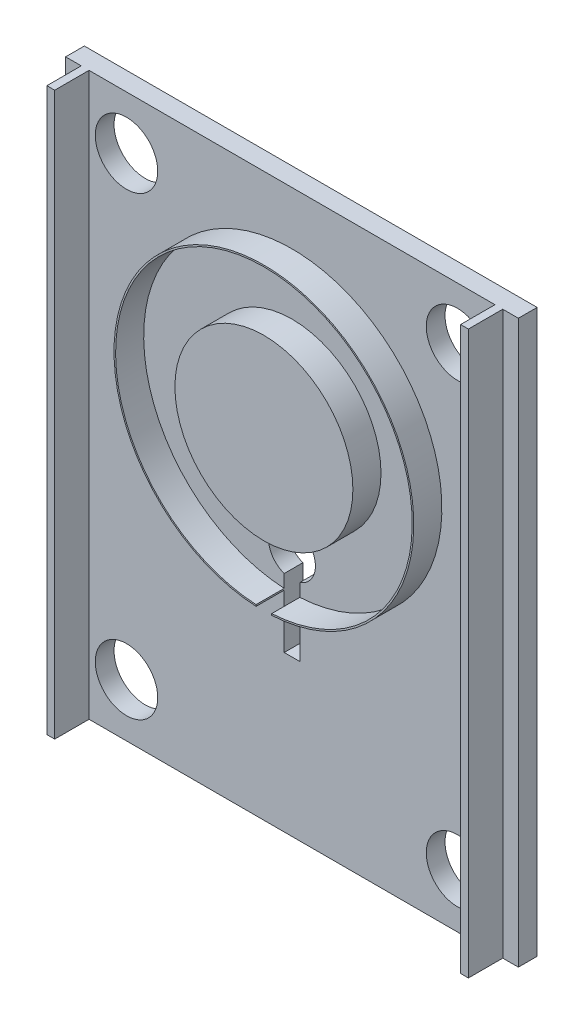
ISO-10303-21;
HEADER;
FILE_DESCRIPTION(('STEP AP214'),'2;1');
FILE_NAME('part.step','',(''),(''),'','','');
FILE_SCHEMA(('AUTOMOTIVE_DESIGN { 1 0 10303 214 1 1 1 1 }'));
ENDSEC;
DATA;
#1=APPLICATION_CONTEXT('core data for automotive mechanical design processes');
#2=APPLICATION_PROTOCOL_DEFINITION('international standard','automotive_design',2000,#1);
#3=PRODUCT_CONTEXT('',#1,'mechanical');
#4=PRODUCT('Part','Part','',(#3));
#5=PRODUCT_RELATED_PRODUCT_CATEGORY('part','',(#4));
#6=PRODUCT_DEFINITION_FORMATION('','',#4);
#7=PRODUCT_DEFINITION_CONTEXT('part definition',#1,'design');
#8=PRODUCT_DEFINITION('design','',#6,#7);
#9=PRODUCT_DEFINITION_SHAPE('','',#8);
#10=(LENGTH_UNIT() NAMED_UNIT(*) SI_UNIT(.MILLI.,.METRE.));
#11=(NAMED_UNIT(*) PLANE_ANGLE_UNIT() SI_UNIT($,.RADIAN.));
#12=(NAMED_UNIT(*) SI_UNIT($,.STERADIAN.) SOLID_ANGLE_UNIT());
#13=UNCERTAINTY_MEASURE_WITH_UNIT(LENGTH_MEASURE(1.E-05),#10,'distance_accuracy_value','');
#14=(GEOMETRIC_REPRESENTATION_CONTEXT(3) GLOBAL_UNCERTAINTY_ASSIGNED_CONTEXT((#13)) GLOBAL_UNIT_ASSIGNED_CONTEXT((#10,
#11,#12)) REPRESENTATION_CONTEXT('',''));
#15=CARTESIAN_POINT('',(0.,0.,0.));
#16=DIRECTION('',(0.,0.,1.));
#17=DIRECTION('',(1.,0.,0.));
#18=AXIS2_PLACEMENT_3D('',#15,#16,#17);
#19=CARTESIAN_POINT('',(0.,25.0080977488986,15.));
#20=DIRECTION('',(0.,0.,-1.));
#21=DIRECTION('',(-1.,0.,0.));
#22=AXIS2_PLACEMENT_3D('',#19,#20,#21);
#23=CYLINDRICAL_SURFACE('',#22,28.5);
#24=CARTESIAN_POINT('',(0.,25.0080977488986,15.));
#25=DIRECTION('',(0.,0.,1.));
#26=DIRECTION('',(1.,0.,0.));
#27=AXIS2_PLACEMENT_3D('',#24,#25,#26);
#28=CIRCLE('',#27,28.5);
#29=CARTESIAN_POINT('',(28.5,25.0080977488986,15.));
#30=VERTEX_POINT('',#29);
#31=EDGE_CURVE('E12',#30,#30,#28,.T.);
#32=ORIENTED_EDGE('',*,*,#31,.F.);
#33=EDGE_LOOP('',(#32));
#34=FACE_BOUND('',#33,.T.);
#35=CARTESIAN_POINT('',(0.,25.0080977488986,0.));
#36=DIRECTION('',(0.,0.,1.));
#37=DIRECTION('',(1.,0.,0.));
#38=AXIS2_PLACEMENT_3D('',#35,#36,#37);
#39=CIRCLE('',#38,28.5);
#40=CARTESIAN_POINT('',(28.5,25.0080977488986,0.));
#41=VERTEX_POINT('',#40);
#42=EDGE_CURVE('E91',#41,#41,#39,.T.);
#43=ORIENTED_EDGE('',*,*,#42,.T.);
#44=EDGE_LOOP('',(#43));
#45=FACE_BOUND('',#44,.T.);
#46=ADVANCED_FACE('F88',(#34,#45),#23,.T.);
#47=CARTESIAN_POINT('',(0.,0.,15.));
#48=DIRECTION('',(0.,0.,1.));
#49=DIRECTION('',(1.,0.,0.));
#50=AXIS2_PLACEMENT_3D('',#47,#48,#49);
#51=PLANE('',#50);
#52=ORIENTED_EDGE('',*,*,#31,.T.);
#53=EDGE_LOOP('',(#52));
#54=FACE_BOUND('',#53,.T.);
#55=ADVANCED_FACE('F103',(#54),#51,.T.);
#56=CARTESIAN_POINT('',(0.,0.,0.));
#57=DIRECTION('',(0.,0.,1.));
#58=DIRECTION('',(1.,0.,0.));
#59=AXIS2_PLACEMENT_3D('',#56,#57,#58);
#60=PLANE('',#59);
#61=ORIENTED_EDGE('',*,*,#42,.F.);
#62=EDGE_LOOP('',(#61));
#63=FACE_BOUND('',#62,.T.);
#64=ADVANCED_FACE('F101',(#63),#60,.F.);
#65=CLOSED_SHELL('',(#46,#55,#64));
#66=MANIFOLD_SOLID_BREP('B2',#65);
#67=CARTESIAN_POINT('',(0.,90.,6.));
#68=DIRECTION('',(0.,-1.,0.));
#69=DIRECTION('',(1.,0.,0.));
#70=AXIS2_PLACEMENT_3D('',#67,#68,#69);
#71=PLANE('',#70);
#72=DIRECTION('',(-1.,0.,0.));
#73=VECTOR('',#72,1.);
#74=CARTESIAN_POINT('',(0.,90.,0.));
#75=LINE('',#74,#73);
#76=CARTESIAN_POINT('',(72.5,90.,0.));
#77=VERTEX_POINT('',#76);
#78=CARTESIAN_POINT('',(-72.5,90.,0.));
#79=VERTEX_POINT('',#78);
#80=EDGE_CURVE('E445',#77,#79,#75,.T.);
#81=ORIENTED_EDGE('',*,*,#80,.T.);
#82=DIRECTION('',(0.,0.,-1.));
#83=VECTOR('',#82,1.);
#84=CARTESIAN_POINT('',(-72.5,90.,6.));
#85=LINE('',#84,#83);
#86=CARTESIAN_POINT('',(-72.5,90.,6.));
#87=VERTEX_POINT('',#86);
#88=EDGE_CURVE('E329',#87,#79,#85,.T.);
#89=ORIENTED_EDGE('',*,*,#88,.F.);
#90=DIRECTION('',(-1.,0.,0.));
#91=VECTOR('',#90,1.);
#92=CARTESIAN_POINT('',(0.,90.,6.));
#93=LINE('',#92,#91);
#94=CARTESIAN_POINT('',(-67.5,90.,6.));
#95=VERTEX_POINT('',#94);
#96=EDGE_CURVE('E327',#95,#87,#93,.T.);
#97=ORIENTED_EDGE('',*,*,#96,.F.);
#98=DIRECTION('',(0.,0.,-1.));
#99=VECTOR('',#98,1.);
#100=CARTESIAN_POINT('',(-67.5,90.,17.));
#101=LINE('',#100,#99);
#102=CARTESIAN_POINT('',(-67.5,90.,17.));
#103=VERTEX_POINT('',#102);
#104=EDGE_CURVE('E352',#103,#95,#101,.T.);
#105=ORIENTED_EDGE('',*,*,#104,.F.);
#106=DIRECTION('',(-1.,0.,0.));
#107=VECTOR('',#106,1.);
#108=CARTESIAN_POINT('',(0.,90.,17.));
#109=LINE('',#108,#107);
#110=CARTESIAN_POINT('',(-65.,90.,17.));
#111=VERTEX_POINT('',#110);
#112=EDGE_CURVE('E340',#111,#103,#109,.T.);
#113=ORIENTED_EDGE('',*,*,#112,.F.);
#114=DIRECTION('',(0.,0.,-1.));
#115=VECTOR('',#114,1.);
#116=CARTESIAN_POINT('',(-65.,90.,17.));
#117=LINE('',#116,#115);
#118=CARTESIAN_POINT('',(-65.,90.,6.));
#119=VERTEX_POINT('',#118);
#120=EDGE_CURVE('E355',#111,#119,#117,.T.);
#121=ORIENTED_EDGE('',*,*,#120,.T.);
#122=DIRECTION('',(-1.,0.,0.));
#123=VECTOR('',#122,1.);
#124=CARTESIAN_POINT('',(0.,90.,6.));
#125=LINE('',#124,#123);
#126=CARTESIAN_POINT('',(65.,90.,6.));
#127=VERTEX_POINT('',#126);
#128=EDGE_CURVE('E418',#127,#119,#125,.T.);
#129=ORIENTED_EDGE('',*,*,#128,.F.);
#130=DIRECTION('',(0.,0.,-1.));
#131=VECTOR('',#130,1.);
#132=CARTESIAN_POINT('',(65.,90.,17.));
#133=LINE('',#132,#131);
#134=CARTESIAN_POINT('',(65.,90.,17.));
#135=VERTEX_POINT('',#134);
#136=EDGE_CURVE('E391',#135,#127,#133,.T.);
#137=ORIENTED_EDGE('',*,*,#136,.F.);
#138=DIRECTION('',(-1.,0.,0.));
#139=VECTOR('',#138,1.);
#140=CARTESIAN_POINT('',(0.,90.,17.));
#141=LINE('',#140,#139);
#142=CARTESIAN_POINT('',(67.5,90.,17.));
#143=VERTEX_POINT('',#142);
#144=EDGE_CURVE('E379',#143,#135,#141,.T.);
#145=ORIENTED_EDGE('',*,*,#144,.F.);
#146=DIRECTION('',(0.,0.,-1.));
#147=VECTOR('',#146,1.);
#148=CARTESIAN_POINT('',(67.5,90.,17.));
#149=LINE('',#148,#147);
#150=CARTESIAN_POINT('',(67.5,90.,6.));
#151=VERTEX_POINT('',#150);
#152=EDGE_CURVE('E394',#143,#151,#149,.T.);
#153=ORIENTED_EDGE('',*,*,#152,.T.);
#154=DIRECTION('',(-1.,0.,0.));
#155=VECTOR('',#154,1.);
#156=CARTESIAN_POINT('',(0.,90.,6.));
#157=LINE('',#156,#155);
#158=CARTESIAN_POINT('',(72.5,90.,6.));
#159=VERTEX_POINT('',#158);
#160=EDGE_CURVE('E359',#159,#151,#157,.T.);
#161=ORIENTED_EDGE('',*,*,#160,.F.);
#162=DIRECTION('',(0.,0.,-1.));
#163=VECTOR('',#162,1.);
#164=CARTESIAN_POINT('',(72.5,90.,6.));
#165=LINE('',#164,#163);
#166=EDGE_CURVE('E368',#159,#77,#165,.T.);
#167=ORIENTED_EDGE('',*,*,#166,.T.);
#168=EDGE_LOOP('',(#81,#89,#97,#105,#113,#121,#129,#137,#145,#153,#161,#167));
#169=FACE_BOUND('',#168,.T.);
#170=ADVANCED_FACE('F129',(#169),#71,.F.);
#171=CARTESIAN_POINT('',(0.,-40.2169424850937,6.));
#172=DIRECTION('',(0.,1.,0.));
#173=DIRECTION('',(-1.,0.,0.));
#174=AXIS2_PLACEMENT_3D('',#171,#172,#173);
#175=PLANE('',#174);
#176=DIRECTION('',(1.,0.,0.));
#177=VECTOR('',#176,1.);
#178=CARTESIAN_POINT('',(0.,-40.2169424850937,0.));
#179=LINE('',#178,#177);
#180=CARTESIAN_POINT('',(-2.5,-40.2169424850937,0.));
#181=VERTEX_POINT('',#180);
#182=CARTESIAN_POINT('',(2.5,-40.2169424850938,0.));
#183=VERTEX_POINT('',#182);
#184=EDGE_CURVE('E396',#181,#183,#179,.T.);
#185=ORIENTED_EDGE('',*,*,#184,.F.);
#186=DIRECTION('',(0.,0.,-1.));
#187=VECTOR('',#186,1.);
#188=CARTESIAN_POINT('',(-2.5,-40.2169424850937,6.));
#189=LINE('',#188,#187);
#190=CARTESIAN_POINT('',(-2.5,-40.2169424850937,6.));
#191=VERTEX_POINT('',#190);
#192=EDGE_CURVE('E86',#191,#181,#189,.T.);
#193=ORIENTED_EDGE('',*,*,#192,.F.);
#194=DIRECTION('',(1.,0.,0.));
#195=VECTOR('',#194,1.);
#196=CARTESIAN_POINT('',(0.,-40.2169424850937,6.));
#197=LINE('',#196,#195);
#198=CARTESIAN_POINT('',(2.5,-40.2169424850938,6.));
#199=VERTEX_POINT('',#198);
#200=EDGE_CURVE('E397',#191,#199,#197,.T.);
#201=ORIENTED_EDGE('',*,*,#200,.T.);
#202=DIRECTION('',(0.,0.,-1.));
#203=VECTOR('',#202,1.);
#204=CARTESIAN_POINT('',(2.5,-40.2169424850938,6.));
#205=LINE('',#204,#203);
#206=EDGE_CURVE('E137',#199,#183,#205,.T.);
#207=ORIENTED_EDGE('',*,*,#206,.T.);
#208=EDGE_LOOP('',(#185,#193,#201,#207));
#209=FACE_BOUND('',#208,.T.);
#210=ADVANCED_FACE('F131',(#209),#175,.T.);
#211=CARTESIAN_POINT('',(-2.5,0.,6.));
#212=DIRECTION('',(-1.,0.,0.));
#213=DIRECTION('',(0.,0.,1.));
#214=AXIS2_PLACEMENT_3D('',#211,#212,#213);
#215=PLANE('',#214);
#216=DIRECTION('',(0.,1.,0.));
#217=VECTOR('',#216,1.);
#218=CARTESIAN_POINT('',(-2.5,0.,0.));
#219=LINE('',#218,#217);
#220=CARTESIAN_POINT('',(-2.5,-18.3069442133662,0.));
#221=VERTEX_POINT('',#220);
#222=EDGE_CURVE('E435',#181,#221,#219,.T.);
#223=ORIENTED_EDGE('',*,*,#222,.T.);
#224=DIRECTION('',(0.,0.,-1.));
#225=VECTOR('',#224,1.);
#226=CARTESIAN_POINT('',(-2.5,-18.3069442133662,6.));
#227=LINE('',#226,#225);
#228=CARTESIAN_POINT('',(-2.5,-18.3069442133662,6.));
#229=VERTEX_POINT('',#228);
#230=EDGE_CURVE('E279',#229,#221,#227,.T.);
#231=ORIENTED_EDGE('',*,*,#230,.F.);
#232=DIRECTION('',(0.,1.,0.));
#233=VECTOR('',#232,1.);
#234=CARTESIAN_POINT('',(-2.5,0.,6.));
#235=LINE('',#234,#233);
#236=CARTESIAN_POINT('',(-2.5,-22.4260671536271,6.));
#237=VERTEX_POINT('',#236);
#238=EDGE_CURVE('E287',#237,#229,#235,.T.);
#239=ORIENTED_EDGE('',*,*,#238,.F.);
#240=DIRECTION('',(0.,0.,-1.));
#241=VECTOR('',#240,1.);
#242=CARTESIAN_POINT('',(-2.5,-22.4260671536271,15.));
#243=LINE('',#242,#241);
#244=CARTESIAN_POINT('',(-2.5,-22.4260671536271,15.));
#245=VERTEX_POINT('',#244);
#246=EDGE_CURVE('E312',#245,#237,#243,.T.);
#247=ORIENTED_EDGE('',*,*,#246,.F.);
#248=DIRECTION('',(0.,1.,0.));
#249=VECTOR('',#248,1.);
#250=CARTESIAN_POINT('',(-2.5,0.,15.));
#251=LINE('',#250,#249);
#252=CARTESIAN_POINT('',(-2.5,-22.9267538728599,15.));
#253=VERTEX_POINT('',#252);
#254=EDGE_CURVE('E306',#253,#245,#251,.T.);
#255=ORIENTED_EDGE('',*,*,#254,.F.);
#256=DIRECTION('',(0.,0.,-1.));
#257=VECTOR('',#256,1.);
#258=CARTESIAN_POINT('',(-2.5,-22.9267538728599,15.));
#259=LINE('',#258,#257);
#260=CARTESIAN_POINT('',(-2.5,-22.9267538728599,6.));
#261=VERTEX_POINT('',#260);
#262=EDGE_CURVE('E315',#253,#261,#259,.T.);
#263=ORIENTED_EDGE('',*,*,#262,.T.);
#264=DIRECTION('',(0.,1.,0.));
#265=VECTOR('',#264,1.);
#266=CARTESIAN_POINT('',(-2.5,0.,6.));
#267=LINE('',#266,#265);
#268=EDGE_CURVE('E400',#191,#261,#267,.T.);
#269=ORIENTED_EDGE('',*,*,#268,.F.);
#270=ORIENTED_EDGE('',*,*,#192,.T.);
#271=EDGE_LOOP('',(#223,#231,#239,#247,#255,#263,#269,#270));
#272=FACE_BOUND('',#271,.T.);
#273=ADVANCED_FACE('F462',(#272),#215,.F.);
#274=CARTESIAN_POINT('',(53.,73.,6.));
#275=DIRECTION('',(0.,0.,-1.));
#276=DIRECTION('',(-1.,0.,0.));
#277=AXIS2_PLACEMENT_3D('',#274,#275,#276);
#278=CYLINDRICAL_SURFACE('',#277,10.);
#279=CARTESIAN_POINT('',(53.,73.,6.));
#280=DIRECTION('',(0.,0.,1.));
#281=DIRECTION('',(1.,0.,0.));
#282=AXIS2_PLACEMENT_3D('',#279,#280,#281);
#283=CIRCLE('',#282,10.);
#284=CARTESIAN_POINT('',(63.,73.,6.));
#285=VERTEX_POINT('',#284);
#286=EDGE_CURVE('E427',#285,#285,#283,.T.);
#287=ORIENTED_EDGE('',*,*,#286,.T.);
#288=EDGE_LOOP('',(#287));
#289=FACE_BOUND('',#288,.T.);
#290=CARTESIAN_POINT('',(53.,73.,0.));
#291=DIRECTION('',(0.,0.,1.));
#292=DIRECTION('',(1.,0.,0.));
#293=AXIS2_PLACEMENT_3D('',#290,#291,#292);
#294=CIRCLE('',#293,10.);
#295=CARTESIAN_POINT('',(63.,73.,0.));
#296=VERTEX_POINT('',#295);
#297=EDGE_CURVE('E449',#296,#296,#294,.T.);
#298=ORIENTED_EDGE('',*,*,#297,.F.);
#299=EDGE_LOOP('',(#298));
#300=FACE_BOUND('',#299,.T.);
#301=ADVANCED_FACE('F510',(#289,#300),#278,.F.);
#302=CARTESIAN_POINT('',(0.,-90.,6.));
#303=DIRECTION('',(0.,-1.,0.));
#304=DIRECTION('',(1.,0.,0.));
#305=AXIS2_PLACEMENT_3D('',#302,#303,#304);
#306=PLANE('',#305);
#307=DIRECTION('',(-1.,0.,0.));
#308=VECTOR('',#307,1.);
#309=CARTESIAN_POINT('',(0.,-90.,0.));
#310=LINE('',#309,#308);
#311=CARTESIAN_POINT('',(72.5,-90.,0.));
#312=VERTEX_POINT('',#311);
#313=CARTESIAN_POINT('',(-72.5,-90.,0.));
#314=VERTEX_POINT('',#313);
#315=EDGE_CURVE('E447',#312,#314,#310,.T.);
#316=ORIENTED_EDGE('',*,*,#315,.F.);
#317=DIRECTION('',(0.,0.,-1.));
#318=VECTOR('',#317,1.);
#319=CARTESIAN_POINT('',(72.5,-90.,6.));
#320=LINE('',#319,#318);
#321=CARTESIAN_POINT('',(72.5,-90.,6.));
#322=VERTEX_POINT('',#321);
#323=EDGE_CURVE('E373',#322,#312,#320,.T.);
#324=ORIENTED_EDGE('',*,*,#323,.F.);
#325=DIRECTION('',(-1.,0.,0.));
#326=VECTOR('',#325,1.);
#327=CARTESIAN_POINT('',(0.,-90.,6.));
#328=LINE('',#327,#326);
#329=CARTESIAN_POINT('',(67.5,-90.,6.));
#330=VERTEX_POINT('',#329);
#331=EDGE_CURVE('E363',#322,#330,#328,.T.);
#332=ORIENTED_EDGE('',*,*,#331,.T.);
#333=DIRECTION('',(0.,0.,-1.));
#334=VECTOR('',#333,1.);
#335=CARTESIAN_POINT('',(67.5,-90.,17.));
#336=LINE('',#335,#334);
#337=CARTESIAN_POINT('',(67.5,-90.,17.));
#338=VERTEX_POINT('',#337);
#339=EDGE_CURVE('E386',#338,#330,#336,.T.);
#340=ORIENTED_EDGE('',*,*,#339,.F.);
#341=DIRECTION('',(-1.,0.,0.));
#342=VECTOR('',#341,1.);
#343=CARTESIAN_POINT('',(0.,-90.,17.));
#344=LINE('',#343,#342);
#345=CARTESIAN_POINT('',(65.,-90.,17.));
#346=VERTEX_POINT('',#345);
#347=EDGE_CURVE('E383',#338,#346,#344,.T.);
#348=ORIENTED_EDGE('',*,*,#347,.T.);
#349=DIRECTION('',(0.,0.,-1.));
#350=VECTOR('',#349,1.);
#351=CARTESIAN_POINT('',(65.,-90.,17.));
#352=LINE('',#351,#350);
#353=CARTESIAN_POINT('',(65.,-90.,6.));
#354=VERTEX_POINT('',#353);
#355=EDGE_CURVE('E388',#346,#354,#352,.T.);
#356=ORIENTED_EDGE('',*,*,#355,.T.);
#357=DIRECTION('',(-1.,0.,0.));
#358=VECTOR('',#357,1.);
#359=CARTESIAN_POINT('',(0.,-90.,6.));
#360=LINE('',#359,#358);
#361=CARTESIAN_POINT('',(-65.,-90.,6.));
#362=VERTEX_POINT('',#361);
#363=EDGE_CURVE('E424',#354,#362,#360,.T.);
#364=ORIENTED_EDGE('',*,*,#363,.T.);
#365=DIRECTION('',(0.,0.,-1.));
#366=VECTOR('',#365,1.);
#367=CARTESIAN_POINT('',(-65.,-90.,17.));
#368=LINE('',#367,#366);
#369=CARTESIAN_POINT('',(-65.,-90.,17.));
#370=VERTEX_POINT('',#369);
#371=EDGE_CURVE('E347',#370,#362,#368,.T.);
#372=ORIENTED_EDGE('',*,*,#371,.F.);
#373=DIRECTION('',(-1.,0.,0.));
#374=VECTOR('',#373,1.);
#375=CARTESIAN_POINT('',(0.,-90.,17.));
#376=LINE('',#375,#374);
#377=CARTESIAN_POINT('',(-67.5,-90.,17.));
#378=VERTEX_POINT('',#377);
#379=EDGE_CURVE('E344',#370,#378,#376,.T.);
#380=ORIENTED_EDGE('',*,*,#379,.T.);
#381=DIRECTION('',(0.,0.,-1.));
#382=VECTOR('',#381,1.);
#383=CARTESIAN_POINT('',(-67.5,-90.,17.));
#384=LINE('',#383,#382);
#385=CARTESIAN_POINT('',(-67.5,-90.,6.));
#386=VERTEX_POINT('',#385);
#387=EDGE_CURVE('E349',#378,#386,#384,.T.);
#388=ORIENTED_EDGE('',*,*,#387,.T.);
#389=DIRECTION('',(-1.,0.,0.));
#390=VECTOR('',#389,1.);
#391=CARTESIAN_POINT('',(0.,-90.,6.));
#392=LINE('',#391,#390);
#393=CARTESIAN_POINT('',(-72.5,-90.,6.));
#394=VERTEX_POINT('',#393);
#395=EDGE_CURVE('E144',#386,#394,#392,.T.);
#396=ORIENTED_EDGE('',*,*,#395,.T.);
#397=DIRECTION('',(0.,0.,-1.));
#398=VECTOR('',#397,1.);
#399=CARTESIAN_POINT('',(-72.5,-90.,6.));
#400=LINE('',#399,#398);
#401=EDGE_CURVE('E334',#394,#314,#400,.T.);
#402=ORIENTED_EDGE('',*,*,#401,.T.);
#403=EDGE_LOOP('',(#316,#324,#332,#340,#348,#356,#364,#372,#380,#388,#396,#402));
#404=FACE_BOUND('',#403,.T.);
#405=ADVANCED_FACE('F497',(#404),#306,.T.);
#406=CARTESIAN_POINT('',(-53.,-73.,6.));
#407=DIRECTION('',(0.,0.,-1.));
#408=DIRECTION('',(-1.,0.,0.));
#409=AXIS2_PLACEMENT_3D('',#406,#407,#408);
#410=CYLINDRICAL_SURFACE('',#409,10.);
#411=CARTESIAN_POINT('',(-53.,-73.,6.));
#412=DIRECTION('',(0.,0.,1.));
#413=DIRECTION('',(1.,0.,0.));
#414=AXIS2_PLACEMENT_3D('',#411,#412,#413);
#415=CIRCLE('',#414,10.);
#416=CARTESIAN_POINT('',(-43.,-73.,6.));
#417=VERTEX_POINT('',#416);
#418=EDGE_CURVE('E412',#417,#417,#415,.T.);
#419=ORIENTED_EDGE('',*,*,#418,.T.);
#420=EDGE_LOOP('',(#419));
#421=FACE_BOUND('',#420,.T.);
#422=CARTESIAN_POINT('',(-53.,-73.,0.));
#423=DIRECTION('',(0.,0.,1.));
#424=DIRECTION('',(1.,0.,0.));
#425=AXIS2_PLACEMENT_3D('',#422,#423,#424);
#426=CIRCLE('',#425,10.);
#427=CARTESIAN_POINT('',(-43.,-73.,0.));
#428=VERTEX_POINT('',#427);
#429=EDGE_CURVE('E442',#428,#428,#426,.T.);
#430=ORIENTED_EDGE('',*,*,#429,.F.);
#431=EDGE_LOOP('',(#430));
#432=FACE_BOUND('',#431,.T.);
#433=ADVANCED_FACE('F499',(#421,#432),#410,.F.);
#434=CARTESIAN_POINT('',(-53.,73.,6.));
#435=DIRECTION('',(0.,0.,-1.));
#436=DIRECTION('',(-1.,0.,0.));
#437=AXIS2_PLACEMENT_3D('',#434,#435,#436);
#438=CYLINDRICAL_SURFACE('',#437,10.);
#439=CARTESIAN_POINT('',(-53.,73.,6.));
#440=DIRECTION('',(0.,0.,1.));
#441=DIRECTION('',(1.,0.,0.));
#442=AXIS2_PLACEMENT_3D('',#439,#440,#441);
#443=CIRCLE('',#442,10.);
#444=CARTESIAN_POINT('',(-43.,73.,6.));
#445=VERTEX_POINT('',#444);
#446=EDGE_CURVE('E409',#445,#445,#443,.F.);
#447=ORIENTED_EDGE('',*,*,#446,.F.);
#448=EDGE_LOOP('',(#447));
#449=FACE_BOUND('',#448,.T.);
#450=CARTESIAN_POINT('',(-53.,73.,0.));
#451=DIRECTION('',(0.,0.,1.));
#452=DIRECTION('',(1.,0.,0.));
#453=AXIS2_PLACEMENT_3D('',#450,#451,#452);
#454=CIRCLE('',#453,10.);
#455=CARTESIAN_POINT('',(-43.,73.,0.));
#456=VERTEX_POINT('',#455);
#457=EDGE_CURVE('E439',#456,#456,#454,.F.);
#458=ORIENTED_EDGE('',*,*,#457,.T.);
#459=EDGE_LOOP('',(#458));
#460=FACE_BOUND('',#459,.T.);
#461=ADVANCED_FACE('F502',(#449,#460),#438,.F.);
#462=CARTESIAN_POINT('',(2.5,0.,6.));
#463=DIRECTION('',(-1.,0.,0.));
#464=DIRECTION('',(0.,0.,1.));
#465=AXIS2_PLACEMENT_3D('',#462,#463,#464);
#466=PLANE('',#465);
#467=DIRECTION('',(0.,1.,0.));
#468=VECTOR('',#467,1.);
#469=CARTESIAN_POINT('',(2.5,0.,0.));
#470=LINE('',#469,#468);
#471=CARTESIAN_POINT('',(2.5,-18.3069442133662,0.));
#472=VERTEX_POINT('',#471);
#473=EDGE_CURVE('E437',#183,#472,#470,.T.);
#474=ORIENTED_EDGE('',*,*,#473,.F.);
#475=ORIENTED_EDGE('',*,*,#206,.F.);
#476=DIRECTION('',(0.,1.,0.));
#477=VECTOR('',#476,1.);
#478=CARTESIAN_POINT('',(2.5,0.,6.));
#479=LINE('',#478,#477);
#480=CARTESIAN_POINT('',(2.5,-22.9267538728599,6.));
#481=VERTEX_POINT('',#480);
#482=EDGE_CURVE('E406',#199,#481,#479,.T.);
#483=ORIENTED_EDGE('',*,*,#482,.T.);
#484=DIRECTION('',(0.,0.,-1.));
#485=VECTOR('',#484,1.);
#486=CARTESIAN_POINT('',(2.5,-22.9267538728599,15.));
#487=LINE('',#486,#485);
#488=CARTESIAN_POINT('',(2.5,-22.9267538728599,15.));
#489=VERTEX_POINT('',#488);
#490=EDGE_CURVE('E318',#489,#481,#487,.T.);
#491=ORIENTED_EDGE('',*,*,#490,.F.);
#492=DIRECTION('',(0.,1.,0.));
#493=VECTOR('',#492,1.);
#494=CARTESIAN_POINT('',(2.5,0.,15.));
#495=LINE('',#494,#493);
#496=CARTESIAN_POINT('',(2.5,-22.4260671536271,15.));
#497=VERTEX_POINT('',#496);
#498=EDGE_CURVE('E278',#489,#497,#495,.T.);
#499=ORIENTED_EDGE('',*,*,#498,.T.);
#500=DIRECTION('',(0.,0.,-1.));
#501=VECTOR('',#500,1.);
#502=CARTESIAN_POINT('',(2.5,-22.4260671536271,15.));
#503=LINE('',#502,#501);
#504=CARTESIAN_POINT('',(2.5,-22.4260671536271,6.));
#505=VERTEX_POINT('',#504);
#506=EDGE_CURVE('E293',#497,#505,#503,.T.);
#507=ORIENTED_EDGE('',*,*,#506,.T.);
#508=DIRECTION('',(0.,1.,0.));
#509=VECTOR('',#508,1.);
#510=CARTESIAN_POINT('',(2.5,0.,6.));
#511=LINE('',#510,#509);
#512=CARTESIAN_POINT('',(2.5,-18.3069442133662,6.));
#513=VERTEX_POINT('',#512);
#514=EDGE_CURVE('E284',#505,#513,#511,.T.);
#515=ORIENTED_EDGE('',*,*,#514,.T.);
#516=DIRECTION('',(0.,0.,-1.));
#517=VECTOR('',#516,1.);
#518=CARTESIAN_POINT('',(2.5,-18.3069442133662,6.));
#519=LINE('',#518,#517);
#520=EDGE_CURVE('E266',#513,#472,#519,.T.);
#521=ORIENTED_EDGE('',*,*,#520,.T.);
#522=EDGE_LOOP('',(#474,#475,#483,#491,#499,#507,#515,#521));
#523=FACE_BOUND('',#522,.T.);
#524=ADVANCED_FACE('F291',(#523),#466,.T.);
#525=CARTESIAN_POINT('',(53.,-73.,6.));
#526=DIRECTION('',(0.,0.,-1.));
#527=DIRECTION('',(-1.,0.,0.));
#528=AXIS2_PLACEMENT_3D('',#525,#526,#527);
#529=CYLINDRICAL_SURFACE('',#528,10.);
#530=CARTESIAN_POINT('',(53.,-73.,6.));
#531=DIRECTION('',(0.,0.,1.));
#532=DIRECTION('',(1.,0.,0.));
#533=AXIS2_PLACEMENT_3D('',#530,#531,#532);
#534=CIRCLE('',#533,10.);
#535=CARTESIAN_POINT('',(63.,-73.,6.));
#536=VERTEX_POINT('',#535);
#537=EDGE_CURVE('E430',#536,#536,#534,.F.);
#538=ORIENTED_EDGE('',*,*,#537,.F.);
#539=EDGE_LOOP('',(#538));
#540=FACE_BOUND('',#539,.T.);
#541=CARTESIAN_POINT('',(53.,-73.,0.));
#542=DIRECTION('',(0.,0.,1.));
#543=DIRECTION('',(1.,0.,0.));
#544=AXIS2_PLACEMENT_3D('',#541,#542,#543);
#545=CIRCLE('',#544,10.);
#546=CARTESIAN_POINT('',(63.,-73.,0.));
#547=VERTEX_POINT('',#546);
#548=EDGE_CURVE('E401',#547,#547,#545,.F.);
#549=ORIENTED_EDGE('',*,*,#548,.T.);
#550=EDGE_LOOP('',(#549));
#551=FACE_BOUND('',#550,.T.);
#552=ADVANCED_FACE('F508',(#540,#551),#529,.F.);
#553=CARTESIAN_POINT('',(0.,0.,6.));
#554=DIRECTION('',(0.,0.,1.));
#555=DIRECTION('',(1.,0.,0.));
#556=AXIS2_PLACEMENT_3D('',#553,#554,#555);
#557=PLANE('',#556);
#558=ORIENTED_EDGE('',*,*,#200,.F.);
#559=ORIENTED_EDGE('',*,*,#268,.T.);
#560=CARTESIAN_POINT('',(0.,25.0080977488986,6.));
#561=DIRECTION('',(0.,0.,1.));
#562=DIRECTION('',(1.,0.,0.));
#563=AXIS2_PLACEMENT_3D('',#560,#561,#562);
#564=CIRCLE('',#563,48.);
#565=EDGE_CURVE('E404',#481,#261,#564,.T.);
#566=ORIENTED_EDGE('',*,*,#565,.F.);
#567=ORIENTED_EDGE('',*,*,#482,.F.);
#568=EDGE_LOOP('',(#558,#559,#566,#567));
#569=FACE_BOUND('',#568,.T.);
#570=ORIENTED_EDGE('',*,*,#446,.T.);
#571=EDGE_LOOP('',(#570));
#572=FACE_BOUND('',#571,.T.);
#573=ORIENTED_EDGE('',*,*,#418,.F.);
#574=EDGE_LOOP('',(#573));
#575=FACE_BOUND('',#574,.T.);
#576=DIRECTION('',(0.,-1.,0.));
#577=VECTOR('',#576,1.);
#578=CARTESIAN_POINT('',(65.,0.,6.));
#579=LINE('',#578,#577);
#580=EDGE_CURVE('E415',#127,#354,#579,.T.);
#581=ORIENTED_EDGE('',*,*,#580,.F.);
#582=ORIENTED_EDGE('',*,*,#128,.T.);
#583=DIRECTION('',(0.,-1.,0.));
#584=VECTOR('',#583,1.);
#585=CARTESIAN_POINT('',(-65.,0.,6.));
#586=LINE('',#585,#584);
#587=EDGE_CURVE('E421',#119,#362,#586,.T.);
#588=ORIENTED_EDGE('',*,*,#587,.T.);
#589=ORIENTED_EDGE('',*,*,#363,.F.);
#590=EDGE_LOOP('',(#581,#582,#588,#589));
#591=FACE_BOUND('',#590,.T.);
#592=ORIENTED_EDGE('',*,*,#286,.F.);
#593=EDGE_LOOP('',(#592));
#594=FACE_BOUND('',#593,.T.);
#595=ORIENTED_EDGE('',*,*,#537,.T.);
#596=EDGE_LOOP('',(#595));
#597=FACE_BOUND('',#596,.T.);
#598=ADVANCED_FACE('F468',(#569,#572,#575,#591,#594,#597),#557,.T.);
#599=CARTESIAN_POINT('',(0.,0.,0.));
#600=DIRECTION('',(0.,0.,1.));
#601=DIRECTION('',(1.,0.,0.));
#602=AXIS2_PLACEMENT_3D('',#599,#600,#601);
#603=PLANE('',#602);
#604=ORIENTED_EDGE('',*,*,#184,.T.);
#605=ORIENTED_EDGE('',*,*,#473,.T.);
#606=CARTESIAN_POINT('',(0.,-11.2358764015007,0.));
#607=DIRECTION('',(0.,0.,1.));
#608=DIRECTION('',(1.,0.,0.));
#609=AXIS2_PLACEMENT_3D('',#606,#607,#608);
#610=CIRCLE('',#609,7.5);
#611=EDGE_CURVE('E273',#472,#221,#610,.T.);
#612=ORIENTED_EDGE('',*,*,#611,.T.);
#613=ORIENTED_EDGE('',*,*,#222,.F.);
#614=EDGE_LOOP('',(#604,#605,#612,#613));
#615=FACE_BOUND('',#614,.T.);
#616=ORIENTED_EDGE('',*,*,#457,.F.);
#617=EDGE_LOOP('',(#616));
#618=FACE_BOUND('',#617,.T.);
#619=ORIENTED_EDGE('',*,*,#429,.T.);
#620=EDGE_LOOP('',(#619));
#621=FACE_BOUND('',#620,.T.);
#622=ORIENTED_EDGE('',*,*,#80,.F.);
#623=DIRECTION('',(0.,1.,0.));
#624=VECTOR('',#623,1.);
#625=CARTESIAN_POINT('',(72.5,0.,0.));
#626=LINE('',#625,#624);
#627=EDGE_CURVE('E358',#312,#77,#626,.T.);
#628=ORIENTED_EDGE('',*,*,#627,.F.);
#629=ORIENTED_EDGE('',*,*,#315,.T.);
#630=DIRECTION('',(0.,1.,0.));
#631=VECTOR('',#630,1.);
#632=CARTESIAN_POINT('',(-72.5,0.,0.));
#633=LINE('',#632,#631);
#634=EDGE_CURVE('E320',#314,#79,#633,.T.);
#635=ORIENTED_EDGE('',*,*,#634,.T.);
#636=EDGE_LOOP('',(#622,#628,#629,#635));
#637=FACE_BOUND('',#636,.T.);
#638=ORIENTED_EDGE('',*,*,#297,.T.);
#639=EDGE_LOOP('',(#638));
#640=FACE_BOUND('',#639,.T.);
#641=ORIENTED_EDGE('',*,*,#548,.F.);
#642=EDGE_LOOP('',(#641));
#643=FACE_BOUND('',#642,.T.);
#644=CARTESIAN_POINT('',(0.,25.0080977488986,0.));
#645=DIRECTION('',(0.,0.,1.));
#646=DIRECTION('',(1.,0.,0.));
#647=AXIS2_PLACEMENT_3D('',#644,#645,#646);
#648=CIRCLE('',#647,28.5);
#649=CARTESIAN_POINT('',(28.5,25.0080977488986,0.));
#650=VERTEX_POINT('',#649);
#651=EDGE_CURVE('E599',#650,#650,#648,.T.);
#652=ORIENTED_EDGE('',*,*,#651,.T.);
#653=EDGE_LOOP('',(#652));
#654=FACE_BOUND('',#653,.T.);
#655=ADVANCED_FACE('F459',(#615,#618,#621,#637,#640,#643,#654),#603,.F.);
#656=CARTESIAN_POINT('',(65.,0.,17.));
#657=DIRECTION('',(1.,0.,0.));
#658=DIRECTION('',(0.,1.,0.));
#659=AXIS2_PLACEMENT_3D('',#656,#657,#658);
#660=PLANE('',#659);
#661=ORIENTED_EDGE('',*,*,#136,.T.);
#662=ORIENTED_EDGE('',*,*,#580,.T.);
#663=ORIENTED_EDGE('',*,*,#355,.F.);
#664=DIRECTION('',(0.,-1.,0.));
#665=VECTOR('',#664,1.);
#666=CARTESIAN_POINT('',(65.,0.,17.));
#667=LINE('',#666,#665);
#668=EDGE_CURVE('E381',#135,#346,#667,.T.);
#669=ORIENTED_EDGE('',*,*,#668,.F.);
#670=EDGE_LOOP('',(#661,#662,#663,#669));
#671=FACE_BOUND('',#670,.T.);
#672=ADVANCED_FACE('F526',(#671),#660,.F.);
#673=CARTESIAN_POINT('',(67.5,0.,17.));
#674=DIRECTION('',(1.,0.,0.));
#675=DIRECTION('',(0.,1.,0.));
#676=AXIS2_PLACEMENT_3D('',#673,#674,#675);
#677=PLANE('',#676);
#678=DIRECTION('',(0.,-1.,0.));
#679=VECTOR('',#678,1.);
#680=CARTESIAN_POINT('',(67.5,0.,6.));
#681=LINE('',#680,#679);
#682=EDGE_CURVE('E152',#151,#330,#681,.T.);
#683=ORIENTED_EDGE('',*,*,#682,.F.);
#684=ORIENTED_EDGE('',*,*,#152,.F.);
#685=DIRECTION('',(0.,-1.,0.));
#686=VECTOR('',#685,1.);
#687=CARTESIAN_POINT('',(67.5,0.,17.));
#688=LINE('',#687,#686);
#689=EDGE_CURVE('E376',#143,#338,#688,.T.);
#690=ORIENTED_EDGE('',*,*,#689,.T.);
#691=ORIENTED_EDGE('',*,*,#339,.T.);
#692=EDGE_LOOP('',(#683,#684,#690,#691));
#693=FACE_BOUND('',#692,.T.);
#694=ADVANCED_FACE('F529',(#693),#677,.T.);
#695=CARTESIAN_POINT('',(0.,0.,17.));
#696=DIRECTION('',(0.,0.,1.));
#697=DIRECTION('',(1.,0.,0.));
#698=AXIS2_PLACEMENT_3D('',#695,#696,#697);
#699=PLANE('',#698);
#700=ORIENTED_EDGE('',*,*,#689,.F.);
#701=ORIENTED_EDGE('',*,*,#144,.T.);
#702=ORIENTED_EDGE('',*,*,#668,.T.);
#703=ORIENTED_EDGE('',*,*,#347,.F.);
#704=EDGE_LOOP('',(#700,#701,#702,#703));
#705=FACE_BOUND('',#704,.T.);
#706=ADVANCED_FACE('F532',(#705),#699,.T.);
#707=CARTESIAN_POINT('',(72.5,0.,6.));
#708=DIRECTION('',(-1.,0.,0.));
#709=DIRECTION('',(0.,0.,1.));
#710=AXIS2_PLACEMENT_3D('',#707,#708,#709);
#711=PLANE('',#710);
#712=ORIENTED_EDGE('',*,*,#627,.T.);
#713=ORIENTED_EDGE('',*,*,#166,.F.);
#714=DIRECTION('',(0.,1.,0.));
#715=VECTOR('',#714,1.);
#716=CARTESIAN_POINT('',(72.5,0.,6.));
#717=LINE('',#716,#715);
#718=EDGE_CURVE('E366',#322,#159,#717,.T.);
#719=ORIENTED_EDGE('',*,*,#718,.F.);
#720=ORIENTED_EDGE('',*,*,#323,.T.);
#721=EDGE_LOOP('',(#712,#713,#719,#720));
#722=FACE_BOUND('',#721,.T.);
#723=ADVANCED_FACE('F538',(#722),#711,.F.);
#724=CARTESIAN_POINT('',(0.,0.,6.));
#725=DIRECTION('',(0.,0.,1.));
#726=DIRECTION('',(1.,0.,0.));
#727=AXIS2_PLACEMENT_3D('',#724,#725,#726);
#728=PLANE('',#727);
#729=ORIENTED_EDGE('',*,*,#160,.T.);
#730=ORIENTED_EDGE('',*,*,#682,.T.);
#731=ORIENTED_EDGE('',*,*,#331,.F.);
#732=ORIENTED_EDGE('',*,*,#718,.T.);
#733=EDGE_LOOP('',(#729,#730,#731,#732));
#734=FACE_BOUND('',#733,.T.);
#735=ADVANCED_FACE('F542',(#734),#728,.T.);
#736=CARTESIAN_POINT('',(-65.,0.,17.));
#737=DIRECTION('',(1.,0.,0.));
#738=DIRECTION('',(0.,1.,0.));
#739=AXIS2_PLACEMENT_3D('',#736,#737,#738);
#740=PLANE('',#739);
#741=ORIENTED_EDGE('',*,*,#587,.F.);
#742=ORIENTED_EDGE('',*,*,#120,.F.);
#743=DIRECTION('',(0.,-1.,0.));
#744=VECTOR('',#743,1.);
#745=CARTESIAN_POINT('',(-65.,0.,17.));
#746=LINE('',#745,#744);
#747=EDGE_CURVE('E337',#111,#370,#746,.T.);
#748=ORIENTED_EDGE('',*,*,#747,.T.);
#749=ORIENTED_EDGE('',*,*,#371,.T.);
#750=EDGE_LOOP('',(#741,#742,#748,#749));
#751=FACE_BOUND('',#750,.T.);
#752=ADVANCED_FACE('F546',(#751),#740,.T.);
#753=CARTESIAN_POINT('',(-67.5,0.,17.));
#754=DIRECTION('',(1.,0.,0.));
#755=DIRECTION('',(0.,1.,0.));
#756=AXIS2_PLACEMENT_3D('',#753,#754,#755);
#757=PLANE('',#756);
#758=ORIENTED_EDGE('',*,*,#104,.T.);
#759=DIRECTION('',(0.,-1.,0.));
#760=VECTOR('',#759,1.);
#761=CARTESIAN_POINT('',(-67.5,0.,6.));
#762=LINE('',#761,#760);
#763=EDGE_CURVE('E325',#95,#386,#762,.T.);
#764=ORIENTED_EDGE('',*,*,#763,.T.);
#765=ORIENTED_EDGE('',*,*,#387,.F.);
#766=DIRECTION('',(0.,-1.,0.));
#767=VECTOR('',#766,1.);
#768=CARTESIAN_POINT('',(-67.5,0.,17.));
#769=LINE('',#768,#767);
#770=EDGE_CURVE('E342',#103,#378,#769,.T.);
#771=ORIENTED_EDGE('',*,*,#770,.F.);
#772=EDGE_LOOP('',(#758,#764,#765,#771));
#773=FACE_BOUND('',#772,.T.);
#774=ADVANCED_FACE('F550',(#773),#757,.F.);
#775=CARTESIAN_POINT('',(0.,0.,17.));
#776=DIRECTION('',(0.,0.,1.));
#777=DIRECTION('',(1.,0.,0.));
#778=AXIS2_PLACEMENT_3D('',#775,#776,#777);
#779=PLANE('',#778);
#780=ORIENTED_EDGE('',*,*,#747,.F.);
#781=ORIENTED_EDGE('',*,*,#112,.T.);
#782=ORIENTED_EDGE('',*,*,#770,.T.);
#783=ORIENTED_EDGE('',*,*,#379,.F.);
#784=EDGE_LOOP('',(#780,#781,#782,#783));
#785=FACE_BOUND('',#784,.T.);
#786=ADVANCED_FACE('F554',(#785),#779,.T.);
#787=CARTESIAN_POINT('',(-72.5,0.,6.));
#788=DIRECTION('',(-1.,0.,0.));
#789=DIRECTION('',(0.,0.,1.));
#790=AXIS2_PLACEMENT_3D('',#787,#788,#789);
#791=PLANE('',#790);
#792=ORIENTED_EDGE('',*,*,#634,.F.);
#793=ORIENTED_EDGE('',*,*,#401,.F.);
#794=DIRECTION('',(0.,1.,0.));
#795=VECTOR('',#794,1.);
#796=CARTESIAN_POINT('',(-72.5,0.,6.));
#797=LINE('',#796,#795);
#798=EDGE_CURVE('E321',#394,#87,#797,.T.);
#799=ORIENTED_EDGE('',*,*,#798,.T.);
#800=ORIENTED_EDGE('',*,*,#88,.T.);
#801=EDGE_LOOP('',(#792,#793,#799,#800));
#802=FACE_BOUND('',#801,.T.);
#803=ADVANCED_FACE('F558',(#802),#791,.T.);
#804=CARTESIAN_POINT('',(0.,0.,6.));
#805=DIRECTION('',(0.,0.,1.));
#806=DIRECTION('',(1.,0.,0.));
#807=AXIS2_PLACEMENT_3D('',#804,#805,#806);
#808=PLANE('',#807);
#809=ORIENTED_EDGE('',*,*,#798,.F.);
#810=ORIENTED_EDGE('',*,*,#395,.F.);
#811=ORIENTED_EDGE('',*,*,#763,.F.);
#812=ORIENTED_EDGE('',*,*,#96,.T.);
#813=EDGE_LOOP('',(#809,#810,#811,#812));
#814=FACE_BOUND('',#813,.T.);
#815=ADVANCED_FACE('F487',(#814),#808,.T.);
#816=CARTESIAN_POINT('',(0.,25.0080977488986,15.));
#817=DIRECTION('',(0.,0.,-1.));
#818=DIRECTION('',(-1.,0.,0.));
#819=AXIS2_PLACEMENT_3D('',#816,#817,#818);
#820=CYLINDRICAL_SURFACE('',#819,48.);
#821=ORIENTED_EDGE('',*,*,#565,.T.);
#822=ORIENTED_EDGE('',*,*,#262,.F.);
#823=CARTESIAN_POINT('',(0.,25.0080977488986,15.));
#824=DIRECTION('',(0.,0.,1.));
#825=DIRECTION('',(1.,0.,0.));
#826=AXIS2_PLACEMENT_3D('',#823,#824,#825);
#827=CIRCLE('',#826,48.);
#828=EDGE_CURVE('E304',#489,#253,#827,.T.);
#829=ORIENTED_EDGE('',*,*,#828,.F.);
#830=ORIENTED_EDGE('',*,*,#490,.T.);
#831=EDGE_LOOP('',(#821,#822,#829,#830));
#832=FACE_BOUND('',#831,.T.);
#833=ADVANCED_FACE('F474',(#832),#820,.T.);
#834=CARTESIAN_POINT('',(0.,25.0080977488986,15.));
#835=DIRECTION('',(0.,0.,-1.));
#836=DIRECTION('',(-1.,0.,0.));
#837=AXIS2_PLACEMENT_3D('',#834,#835,#836);
#838=CYLINDRICAL_SURFACE('',#837,47.5);
#839=CARTESIAN_POINT('',(0.,25.0080977488986,6.));
#840=DIRECTION('',(0.,0.,1.));
#841=DIRECTION('',(1.,0.,0.));
#842=AXIS2_PLACEMENT_3D('',#839,#840,#841);
#843=CIRCLE('',#842,47.5);
#844=EDGE_CURVE('E294',#505,#237,#843,.T.);
#845=ORIENTED_EDGE('',*,*,#844,.F.);
#846=ORIENTED_EDGE('',*,*,#506,.F.);
#847=CARTESIAN_POINT('',(0.,25.0080977488986,15.));
#848=DIRECTION('',(0.,0.,1.));
#849=DIRECTION('',(1.,0.,0.));
#850=AXIS2_PLACEMENT_3D('',#847,#848,#849);
#851=CIRCLE('',#850,47.5);
#852=EDGE_CURVE('E308',#497,#245,#851,.T.);
#853=ORIENTED_EDGE('',*,*,#852,.T.);
#854=ORIENTED_EDGE('',*,*,#246,.T.);
#855=EDGE_LOOP('',(#845,#846,#853,#854));
#856=FACE_BOUND('',#855,.T.);
#857=ADVANCED_FACE('F479',(#856),#838,.F.);
#858=CARTESIAN_POINT('',(0.,0.,15.));
#859=DIRECTION('',(0.,0.,1.));
#860=DIRECTION('',(1.,0.,0.));
#861=AXIS2_PLACEMENT_3D('',#858,#859,#860);
#862=PLANE('',#861);
#863=ORIENTED_EDGE('',*,*,#498,.F.);
#864=ORIENTED_EDGE('',*,*,#828,.T.);
#865=ORIENTED_EDGE('',*,*,#254,.T.);
#866=ORIENTED_EDGE('',*,*,#852,.F.);
#867=EDGE_LOOP('',(#863,#864,#865,#866));
#868=FACE_BOUND('',#867,.T.);
#869=ADVANCED_FACE('F476',(#868),#862,.T.);
#870=CARTESIAN_POINT('',(0.,-11.2358764015007,6.));
#871=DIRECTION('',(0.,0.,-1.));
#872=DIRECTION('',(-1.,0.,0.));
#873=AXIS2_PLACEMENT_3D('',#870,#871,#872);
#874=CYLINDRICAL_SURFACE('',#873,7.5);
#875=ORIENTED_EDGE('',*,*,#611,.F.);
#876=ORIENTED_EDGE('',*,*,#520,.F.);
#877=CARTESIAN_POINT('',(0.,-11.2358764015007,6.));
#878=DIRECTION('',(0.,0.,1.));
#879=DIRECTION('',(1.,0.,0.));
#880=AXIS2_PLACEMENT_3D('',#877,#878,#879);
#881=CIRCLE('',#880,7.5);
#882=EDGE_CURVE('E270',#513,#229,#881,.T.);
#883=ORIENTED_EDGE('',*,*,#882,.T.);
#884=ORIENTED_EDGE('',*,*,#230,.T.);
#885=EDGE_LOOP('',(#875,#876,#883,#884));
#886=FACE_BOUND('',#885,.T.);
#887=ADVANCED_FACE('F268',(#886),#874,.F.);
#888=CARTESIAN_POINT('',(0.,0.,6.));
#889=DIRECTION('',(0.,0.,1.));
#890=DIRECTION('',(1.,0.,0.));
#891=AXIS2_PLACEMENT_3D('',#888,#889,#890);
#892=PLANE('',#891);
#893=ORIENTED_EDGE('',*,*,#238,.T.);
#894=ORIENTED_EDGE('',*,*,#882,.F.);
#895=ORIENTED_EDGE('',*,*,#514,.F.);
#896=ORIENTED_EDGE('',*,*,#844,.T.);
#897=EDGE_LOOP('',(#893,#894,#895,#896));
#898=FACE_BOUND('',#897,.T.);
#899=CARTESIAN_POINT('',(0.,25.0080977488986,6.));
#900=DIRECTION('',(0.,0.,1.));
#901=DIRECTION('',(1.,0.,0.));
#902=AXIS2_PLACEMENT_3D('',#899,#900,#901);
#903=CIRCLE('',#902,28.5);
#904=CARTESIAN_POINT('',(28.5,25.0080977488986,6.));
#905=VERTEX_POINT('',#904);
#906=EDGE_CURVE('E301',#905,#905,#903,.T.);
#907=ORIENTED_EDGE('',*,*,#906,.F.);
#908=EDGE_LOOP('',(#907));
#909=FACE_BOUND('',#908,.T.);
#910=ADVANCED_FACE('F282',(#898,#909),#892,.T.);
#911=CARTESIAN_POINT('',(0.,25.0080977488986,6.));
#912=DIRECTION('',(0.,0.,-1.));
#913=DIRECTION('',(-1.,0.,0.));
#914=AXIS2_PLACEMENT_3D('',#911,#912,#913);
#915=CYLINDRICAL_SURFACE('',#914,28.5);
#916=ORIENTED_EDGE('',*,*,#906,.T.);
#917=EDGE_LOOP('',(#916));
#918=FACE_BOUND('',#917,.T.);
#919=ORIENTED_EDGE('',*,*,#651,.F.);
#920=EDGE_LOOP('',(#919));
#921=FACE_BOUND('',#920,.T.);
#922=ADVANCED_FACE('F605',(#918,#921),#915,.F.);
#923=CLOSED_SHELL('',(#170,#210,#273,#301,#405,#433,#461,#524,#552,#598,#655,#672,#694,#706,
#723,#735,#752,#774,#786,#803,#815,#833,#857,#869,#887,#910,#922));
#924=MANIFOLD_SOLID_BREP('B7',#923);
#925=ADVANCED_BREP_SHAPE_REPRESENTATION('',(#18,#66,#924),#14);
#926=SHAPE_DEFINITION_REPRESENTATION(#9,#925);
ENDSEC;
END-ISO-10303-21;
